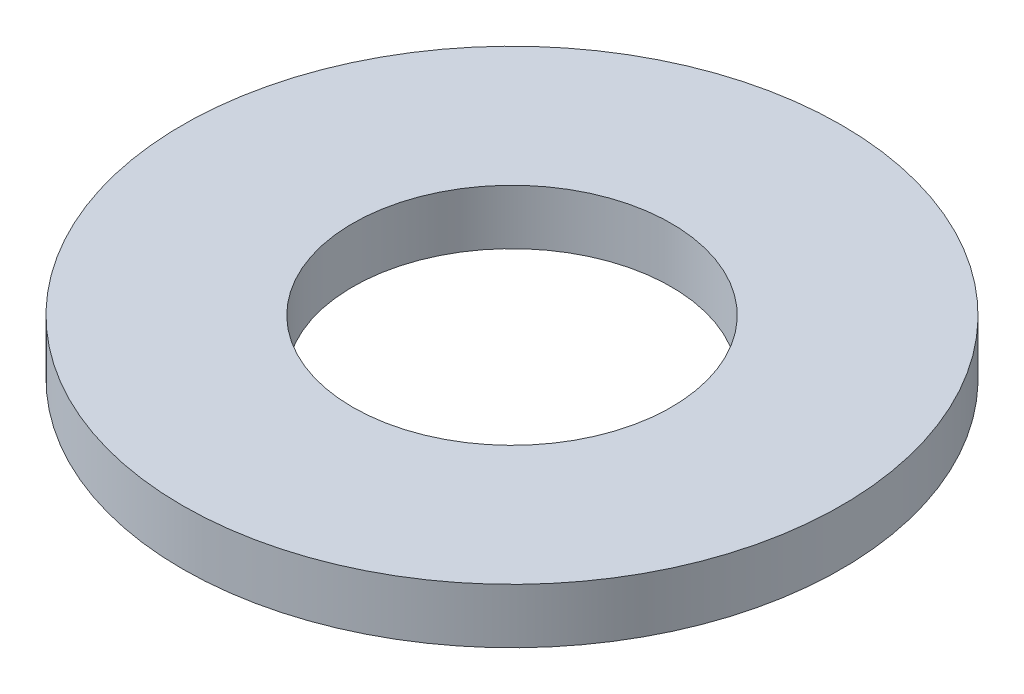
ISO-10303-21;
HEADER;
FILE_DESCRIPTION(('STEP AP214'),'2;1');
FILE_NAME('part.step','',(''),(''),'','','');
FILE_SCHEMA(('AUTOMOTIVE_DESIGN { 1 0 10303 214 1 1 1 1 }'));
ENDSEC;
DATA;
#1=APPLICATION_CONTEXT('core data for automotive mechanical design processes');
#2=APPLICATION_PROTOCOL_DEFINITION('international standard','automotive_design',2000,#1);
#3=PRODUCT_CONTEXT('',#1,'mechanical');
#4=PRODUCT('Part','Part','',(#3));
#5=PRODUCT_RELATED_PRODUCT_CATEGORY('part','',(#4));
#6=PRODUCT_DEFINITION_FORMATION('','',#4);
#7=PRODUCT_DEFINITION_CONTEXT('part definition',#1,'design');
#8=PRODUCT_DEFINITION('design','',#6,#7);
#9=PRODUCT_DEFINITION_SHAPE('','',#8);
#10=(LENGTH_UNIT() NAMED_UNIT(*) SI_UNIT(.MILLI.,.METRE.));
#11=(NAMED_UNIT(*) PLANE_ANGLE_UNIT() SI_UNIT($,.RADIAN.));
#12=(NAMED_UNIT(*) SI_UNIT($,.STERADIAN.) SOLID_ANGLE_UNIT());
#13=UNCERTAINTY_MEASURE_WITH_UNIT(LENGTH_MEASURE(1.E-05),#10,'distance_accuracy_value','');
#14=(GEOMETRIC_REPRESENTATION_CONTEXT(3) GLOBAL_UNCERTAINTY_ASSIGNED_CONTEXT((#13)) GLOBAL_UNIT_ASSIGNED_CONTEXT((#10,
#11,#12)) REPRESENTATION_CONTEXT('',''));
#15=CARTESIAN_POINT('',(0.,0.,0.));
#16=DIRECTION('',(0.,0.,1.));
#17=DIRECTION('',(1.,0.,0.));
#18=AXIS2_PLACEMENT_3D('',#15,#16,#17);
#19=CARTESIAN_POINT('',(0.,0.5,0.));
#20=DIRECTION('',(0.,1.,0.));
#21=DIRECTION('',(0.,0.,1.));
#22=AXIS2_PLACEMENT_3D('',#19,#20,#21);
#23=PLANE('',#22);
#24=CARTESIAN_POINT('',(0.,0.5,0.));
#25=DIRECTION('',(0.,1.,0.));
#26=DIRECTION('',(0.,0.,1.));
#27=AXIS2_PLACEMENT_3D('',#24,#25,#26);
#28=CIRCLE('',#27,3.);
#29=CARTESIAN_POINT('',(0.,0.5,3.));
#30=VERTEX_POINT('',#29);
#31=EDGE_CURVE('E10',#30,#30,#28,.T.);
#32=ORIENTED_EDGE('',*,*,#31,.T.);
#33=EDGE_LOOP('',(#32));
#34=FACE_BOUND('',#33,.T.);
#35=CARTESIAN_POINT('',(0.,0.5,0.));
#36=DIRECTION('',(0.,1.,0.));
#37=DIRECTION('',(0.,0.,1.));
#38=AXIS2_PLACEMENT_3D('',#35,#36,#37);
#39=CIRCLE('',#38,1.45);
#40=CARTESIAN_POINT('',(0.,0.5,1.45));
#41=VERTEX_POINT('',#40);
#42=EDGE_CURVE('E44',#41,#41,#39,.T.);
#43=ORIENTED_EDGE('',*,*,#42,.F.);
#44=EDGE_LOOP('',(#43));
#45=FACE_BOUND('',#44,.T.);
#46=ADVANCED_FACE('F33',(#34,#45),#23,.T.);
#47=CARTESIAN_POINT('',(0.,0.,0.));
#48=DIRECTION('',(0.,1.,0.));
#49=DIRECTION('',(0.,0.,1.));
#50=AXIS2_PLACEMENT_3D('',#47,#48,#49);
#51=PLANE('',#50);
#52=CARTESIAN_POINT('',(0.,0.,0.));
#53=DIRECTION('',(0.,1.,0.));
#54=DIRECTION('',(0.,0.,1.));
#55=AXIS2_PLACEMENT_3D('',#52,#53,#54);
#56=CIRCLE('',#55,3.);
#57=CARTESIAN_POINT('',(0.,0.,3.));
#58=VERTEX_POINT('',#57);
#59=EDGE_CURVE('E37',#58,#58,#56,.T.);
#60=ORIENTED_EDGE('',*,*,#59,.F.);
#61=EDGE_LOOP('',(#60));
#62=FACE_BOUND('',#61,.T.);
#63=CARTESIAN_POINT('',(0.,0.,0.));
#64=DIRECTION('',(0.,1.,0.));
#65=DIRECTION('',(0.,0.,1.));
#66=AXIS2_PLACEMENT_3D('',#63,#64,#65);
#67=CIRCLE('',#66,1.45);
#68=CARTESIAN_POINT('',(0.,0.,1.45));
#69=VERTEX_POINT('',#68);
#70=EDGE_CURVE('E46',#69,#69,#67,.T.);
#71=ORIENTED_EDGE('',*,*,#70,.T.);
#72=EDGE_LOOP('',(#71));
#73=FACE_BOUND('',#72,.T.);
#74=ADVANCED_FACE('F56',(#62,#73),#51,.F.);
#75=CARTESIAN_POINT('',(0.,0.5,0.));
#76=DIRECTION('',(0.,-1.,0.));
#77=DIRECTION('',(0.,0.,-1.));
#78=AXIS2_PLACEMENT_3D('',#75,#76,#77);
#79=CYLINDRICAL_SURFACE('',#78,3.);
#80=ORIENTED_EDGE('',*,*,#31,.F.);
#81=EDGE_LOOP('',(#80));
#82=FACE_BOUND('',#81,.T.);
#83=ORIENTED_EDGE('',*,*,#59,.T.);
#84=EDGE_LOOP('',(#83));
#85=FACE_BOUND('',#84,.T.);
#86=ADVANCED_FACE('F35',(#82,#85),#79,.T.);
#87=CARTESIAN_POINT('',(0.,0.5,0.));
#88=DIRECTION('',(0.,-1.,0.));
#89=DIRECTION('',(0.,0.,-1.));
#90=AXIS2_PLACEMENT_3D('',#87,#88,#89);
#91=CYLINDRICAL_SURFACE('',#90,1.45);
#92=ORIENTED_EDGE('',*,*,#42,.T.);
#93=EDGE_LOOP('',(#92));
#94=FACE_BOUND('',#93,.T.);
#95=ORIENTED_EDGE('',*,*,#70,.F.);
#96=EDGE_LOOP('',(#95));
#97=FACE_BOUND('',#96,.T.);
#98=ADVANCED_FACE('F52',(#94,#97),#91,.F.);
#99=CLOSED_SHELL('',(#46,#74,#86,#98));
#100=MANIFOLD_SOLID_BREP('B2',#99);
#101=ADVANCED_BREP_SHAPE_REPRESENTATION('',(#18,#100),#14);
#102=SHAPE_DEFINITION_REPRESENTATION(#9,#101);
ENDSEC;
END-ISO-10303-21;
